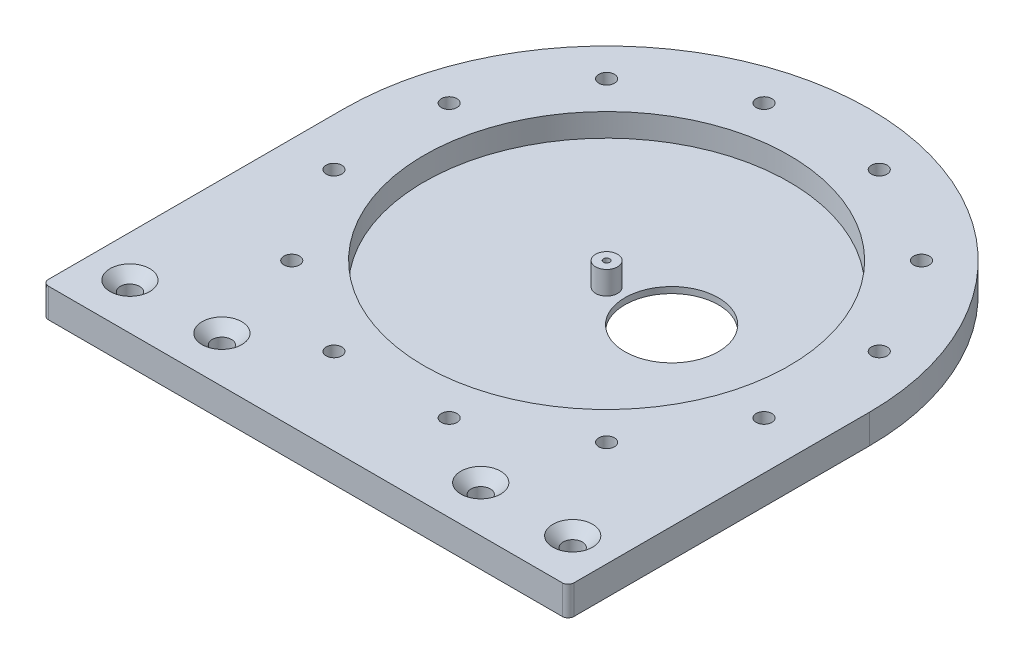
ISO-10303-21;
HEADER;
FILE_DESCRIPTION(('STEP AP214'),'2;1');
FILE_NAME('part.step','',(''),(''),'','','');
FILE_SCHEMA(('AUTOMOTIVE_DESIGN { 1 0 10303 214 1 1 1 1 }'));
ENDSEC;
DATA;
#1=APPLICATION_CONTEXT('core data for automotive mechanical design processes');
#2=APPLICATION_PROTOCOL_DEFINITION('international standard','automotive_design',2000,#1);
#3=PRODUCT_CONTEXT('',#1,'mechanical');
#4=PRODUCT('Part','Part','',(#3));
#5=PRODUCT_RELATED_PRODUCT_CATEGORY('part','',(#4));
#6=PRODUCT_DEFINITION_FORMATION('','',#4);
#7=PRODUCT_DEFINITION_CONTEXT('part definition',#1,'design');
#8=PRODUCT_DEFINITION('design','',#6,#7);
#9=PRODUCT_DEFINITION_SHAPE('','',#8);
#10=(LENGTH_UNIT() NAMED_UNIT(*) SI_UNIT(.MILLI.,.METRE.));
#11=(NAMED_UNIT(*) PLANE_ANGLE_UNIT() SI_UNIT($,.RADIAN.));
#12=(NAMED_UNIT(*) SI_UNIT($,.STERADIAN.) SOLID_ANGLE_UNIT());
#13=UNCERTAINTY_MEASURE_WITH_UNIT(LENGTH_MEASURE(1.E-05),#10,'distance_accuracy_value','');
#14=(GEOMETRIC_REPRESENTATION_CONTEXT(3) GLOBAL_UNCERTAINTY_ASSIGNED_CONTEXT((#13)) GLOBAL_UNIT_ASSIGNED_CONTEXT((#10,
#11,#12)) REPRESENTATION_CONTEXT('',''));
#15=CARTESIAN_POINT('',(0.,0.,0.));
#16=DIRECTION('',(0.,0.,1.));
#17=DIRECTION('',(1.,0.,0.));
#18=AXIS2_PLACEMENT_3D('',#15,#16,#17);
#19=CARTESIAN_POINT('',(0.,12.7,0.));
#20=DIRECTION('',(0.,1.,0.));
#21=DIRECTION('',(0.,0.,1.));
#22=AXIS2_PLACEMENT_3D('',#19,#20,#21);
#23=PLANE('',#22);
#24=CARTESIAN_POINT('',(-96.3,12.7,111.040453687));
#25=DIRECTION('',(0.,1.,0.));
#26=DIRECTION('',(0.,0.,1.));
#27=AXIS2_PLACEMENT_3D('',#24,#25,#26);
#28=CIRCLE('',#27,8.65000000000001);
#29=CARTESIAN_POINT('',(-96.3,12.7,119.690453687));
#30=VERTEX_POINT('',#29);
#31=EDGE_CURVE('E308',#30,#30,#28,.T.);
#32=ORIENTED_EDGE('',*,*,#31,.F.);
#33=EDGE_LOOP('',(#32));
#34=FACE_BOUND('',#33,.T.);
#35=CARTESIAN_POINT('',(-56.3,12.7,111.040453687));
#36=DIRECTION('',(0.,1.,0.));
#37=DIRECTION('',(0.,0.,1.));
#38=AXIS2_PLACEMENT_3D('',#35,#36,#37);
#39=CIRCLE('',#38,8.65);
#40=CARTESIAN_POINT('',(-56.3,12.7,119.690453687));
#41=VERTEX_POINT('',#40);
#42=EDGE_CURVE('E319',#41,#41,#39,.T.);
#43=ORIENTED_EDGE('',*,*,#42,.F.);
#44=EDGE_LOOP('',(#43));
#45=FACE_BOUND('',#44,.T.);
#46=CARTESIAN_POINT('',(56.3,12.7,111.040453687));
#47=DIRECTION('',(0.,1.,0.));
#48=DIRECTION('',(0.,0.,1.));
#49=AXIS2_PLACEMENT_3D('',#46,#47,#48);
#50=CIRCLE('',#49,8.65);
#51=CARTESIAN_POINT('',(56.3,12.7,119.690453687));
#52=VERTEX_POINT('',#51);
#53=EDGE_CURVE('E328',#52,#52,#50,.T.);
#54=ORIENTED_EDGE('',*,*,#53,.F.);
#55=EDGE_LOOP('',(#54));
#56=FACE_BOUND('',#55,.T.);
#57=CARTESIAN_POINT('',(96.3,12.7,111.040453687));
#58=DIRECTION('',(0.,1.,0.));
#59=DIRECTION('',(0.,0.,1.));
#60=AXIS2_PLACEMENT_3D('',#57,#58,#59);
#61=CIRCLE('',#60,8.65000000000001);
#62=CARTESIAN_POINT('',(96.3,12.7,119.690453687));
#63=VERTEX_POINT('',#62);
#64=EDGE_CURVE('E337',#63,#63,#61,.T.);
#65=ORIENTED_EDGE('',*,*,#64,.F.);
#66=EDGE_LOOP('',(#65));
#67=FACE_BOUND('',#66,.T.);
#68=CARTESIAN_POINT('',(-93.5378422032675,12.7,-25.063389280116));
#69=DIRECTION('',(0.,1.,0.));
#70=DIRECTION('',(0.,0.,1.));
#71=AXIS2_PLACEMENT_3D('',#68,#69,#70);
#72=CIRCLE('',#71,3.4);
#73=CARTESIAN_POINT('',(-93.5378422032675,12.7,-21.663389280116));
#74=VERTEX_POINT('',#73);
#75=EDGE_CURVE('E346',#74,#74,#72,.T.);
#76=ORIENTED_EDGE('',*,*,#75,.F.);
#77=EDGE_LOOP('',(#76));
#78=FACE_BOUND('',#77,.T.);
#79=CARTESIAN_POINT('',(-93.5378422032678,12.7,25.0633892801148));
#80=DIRECTION('',(0.,1.,0.));
#81=DIRECTION('',(0.,0.,1.));
#82=AXIS2_PLACEMENT_3D('',#79,#80,#81);
#83=CIRCLE('',#82,3.4);
#84=CARTESIAN_POINT('',(-93.5378422032678,12.7,28.4633892801148));
#85=VERTEX_POINT('',#84);
#86=EDGE_CURVE('E352',#85,#85,#83,.T.);
#87=ORIENTED_EDGE('',*,*,#86,.F.);
#88=EDGE_LOOP('',(#87));
#89=FACE_BOUND('',#88,.T.);
#90=CARTESIAN_POINT('',(-25.0633892801151,12.7,-93.5378422032677));
#91=DIRECTION('',(0.,1.,0.));
#92=DIRECTION('',(0.,0.,1.));
#93=AXIS2_PLACEMENT_3D('',#90,#91,#92);
#94=CIRCLE('',#93,3.4);
#95=CARTESIAN_POINT('',(-25.0633892801151,12.7,-90.1378422032677));
#96=VERTEX_POINT('',#95);
#97=EDGE_CURVE('E358',#96,#96,#94,.T.);
#98=ORIENTED_EDGE('',*,*,#97,.F.);
#99=EDGE_LOOP('',(#98));
#100=FACE_BOUND('',#99,.T.);
#101=CARTESIAN_POINT('',(-68.4744529231522,12.7,-68.4744529231524));
#102=DIRECTION('',(0.,1.,0.));
#103=DIRECTION('',(0.,0.,1.));
#104=AXIS2_PLACEMENT_3D('',#101,#102,#103);
#105=CIRCLE('',#104,3.4);
#106=CARTESIAN_POINT('',(-68.4744529231522,12.7,-65.0744529231524));
#107=VERTEX_POINT('',#106);
#108=EDGE_CURVE('E364',#107,#107,#105,.T.);
#109=ORIENTED_EDGE('',*,*,#108,.F.);
#110=EDGE_LOOP('',(#109));
#111=FACE_BOUND('',#110,.T.);
#112=CARTESIAN_POINT('',(25.0633892801151,12.7,-93.5378422032677));
#113=DIRECTION('',(0.,1.,0.));
#114=DIRECTION('',(0.,0.,1.));
#115=AXIS2_PLACEMENT_3D('',#112,#113,#114);
#116=CIRCLE('',#115,3.4);
#117=CARTESIAN_POINT('',(25.0633892801151,12.7,-90.1378422032677));
#118=VERTEX_POINT('',#117);
#119=EDGE_CURVE('E370',#118,#118,#116,.T.);
#120=ORIENTED_EDGE('',*,*,#119,.F.);
#121=EDGE_LOOP('',(#120));
#122=FACE_BOUND('',#121,.T.);
#123=CARTESIAN_POINT('',(68.4744529231516,12.7,-68.474452923153));
#124=DIRECTION('',(0.,1.,0.));
#125=DIRECTION('',(0.,0.,1.));
#126=AXIS2_PLACEMENT_3D('',#123,#124,#125);
#127=CIRCLE('',#126,3.4);
#128=CARTESIAN_POINT('',(68.4744529231516,12.7,-65.074452923153));
#129=VERTEX_POINT('',#128);
#130=EDGE_CURVE('E376',#129,#129,#127,.T.);
#131=ORIENTED_EDGE('',*,*,#130,.F.);
#132=EDGE_LOOP('',(#131));
#133=FACE_BOUND('',#132,.T.);
#134=CARTESIAN_POINT('',(93.5378422032673,12.7,-25.0633892801167));
#135=DIRECTION('',(0.,1.,0.));
#136=DIRECTION('',(0.,0.,1.));
#137=AXIS2_PLACEMENT_3D('',#134,#135,#136);
#138=CIRCLE('',#137,3.4);
#139=CARTESIAN_POINT('',(93.5378422032673,12.7,-21.6633892801167));
#140=VERTEX_POINT('',#139);
#141=EDGE_CURVE('E382',#140,#140,#138,.T.);
#142=ORIENTED_EDGE('',*,*,#141,.F.);
#143=EDGE_LOOP('',(#142));
#144=FACE_BOUND('',#143,.T.);
#145=CARTESIAN_POINT('',(93.5378422032673,12.7,25.0633892801167));
#146=DIRECTION('',(0.,1.,0.));
#147=DIRECTION('',(0.,0.,1.));
#148=AXIS2_PLACEMENT_3D('',#145,#146,#147);
#149=CIRCLE('',#148,3.4);
#150=CARTESIAN_POINT('',(93.5378422032673,12.7,28.4633892801167));
#151=VERTEX_POINT('',#150);
#152=EDGE_CURVE('E388',#151,#151,#149,.T.);
#153=ORIENTED_EDGE('',*,*,#152,.F.);
#154=EDGE_LOOP('',(#153));
#155=FACE_BOUND('',#154,.T.);
#156=CARTESIAN_POINT('',(68.4744529231519,12.7,68.4744529231527));
#157=DIRECTION('',(0.,1.,0.));
#158=DIRECTION('',(0.,0.,1.));
#159=AXIS2_PLACEMENT_3D('',#156,#157,#158);
#160=CIRCLE('',#159,3.4);
#161=CARTESIAN_POINT('',(68.4744529231519,12.7,71.8744529231527));
#162=VERTEX_POINT('',#161);
#163=EDGE_CURVE('E394',#162,#162,#160,.T.);
#164=ORIENTED_EDGE('',*,*,#163,.F.);
#165=EDGE_LOOP('',(#164));
#166=FACE_BOUND('',#165,.T.);
#167=CARTESIAN_POINT('',(25.0633892801151,12.7,93.5378422032677));
#168=DIRECTION('',(0.,1.,0.));
#169=DIRECTION('',(0.,0.,1.));
#170=AXIS2_PLACEMENT_3D('',#167,#168,#169);
#171=CIRCLE('',#170,3.4);
#172=CARTESIAN_POINT('',(25.0633892801151,12.7,96.9378422032677));
#173=VERTEX_POINT('',#172);
#174=EDGE_CURVE('E400',#173,#173,#171,.T.);
#175=ORIENTED_EDGE('',*,*,#174,.F.);
#176=EDGE_LOOP('',(#175));
#177=FACE_BOUND('',#176,.T.);
#178=CARTESIAN_POINT('',(-25.0633892801158,12.7,93.5378422032675));
#179=DIRECTION('',(0.,1.,0.));
#180=DIRECTION('',(0.,0.,1.));
#181=AXIS2_PLACEMENT_3D('',#178,#179,#180);
#182=CIRCLE('',#181,3.4);
#183=CARTESIAN_POINT('',(-25.0633892801158,12.7,96.9378422032675));
#184=VERTEX_POINT('',#183);
#185=EDGE_CURVE('E406',#184,#184,#182,.T.);
#186=ORIENTED_EDGE('',*,*,#185,.F.);
#187=EDGE_LOOP('',(#186));
#188=FACE_BOUND('',#187,.T.);
#189=CARTESIAN_POINT('',(-68.4744529231526,12.7,68.474452923152));
#190=DIRECTION('',(0.,1.,0.));
#191=DIRECTION('',(0.,0.,1.));
#192=AXIS2_PLACEMENT_3D('',#189,#190,#191);
#193=CIRCLE('',#192,3.4);
#194=CARTESIAN_POINT('',(-68.4744529231526,12.7,71.874452923152));
#195=VERTEX_POINT('',#194);
#196=EDGE_CURVE('E198',#195,#195,#193,.T.);
#197=ORIENTED_EDGE('',*,*,#196,.F.);
#198=EDGE_LOOP('',(#197));
#199=FACE_BOUND('',#198,.T.);
#200=CARTESIAN_POINT('',(0.,12.7,0.));
#201=DIRECTION('',(0.,1.,0.));
#202=DIRECTION('',(0.,0.,1.));
#203=AXIS2_PLACEMENT_3D('',#200,#201,#202);
#204=CIRCLE('',#203,79.375);
#205=CARTESIAN_POINT('',(0.,12.7,79.375));
#206=VERTEX_POINT('',#205);
#207=EDGE_CURVE('E195',#206,#206,#204,.T.);
#208=ORIENTED_EDGE('',*,*,#207,.F.);
#209=EDGE_LOOP('',(#208));
#210=FACE_BOUND('',#209,.T.);
#211=DIRECTION('',(0.,0.,1.));
#212=VECTOR('',#211,1.);
#213=CARTESIAN_POINT('',(-114.3,12.7,0.));
#214=LINE('',#213,#212);
#215=CARTESIAN_POINT('',(-114.3,12.7,0.));
#216=VERTEX_POINT('',#215);
#217=CARTESIAN_POINT('',(-114.3,12.7,128.500453687));
#218=VERTEX_POINT('',#217);
#219=EDGE_CURVE('E88',#216,#218,#214,.T.);
#220=ORIENTED_EDGE('',*,*,#219,.T.);
#221=CARTESIAN_POINT('',(-111.76,12.7,128.500453687));
#222=DIRECTION('',(0.,1.,0.));
#223=DIRECTION('',(0.,0.,1.));
#224=AXIS2_PLACEMENT_3D('',#221,#222,#223);
#225=CIRCLE('',#224,2.54);
#226=CARTESIAN_POINT('',(-111.76,12.7,131.040453687));
#227=VERTEX_POINT('',#226);
#228=EDGE_CURVE('E43',#218,#227,#225,.T.);
#229=ORIENTED_EDGE('',*,*,#228,.T.);
#230=DIRECTION('',(1.,0.,0.));
#231=VECTOR('',#230,1.);
#232=CARTESIAN_POINT('',(-114.3,12.7,131.040453687));
#233=LINE('',#232,#231);
#234=CARTESIAN_POINT('',(111.76,12.7,131.040453687));
#235=VERTEX_POINT('',#234);
#236=EDGE_CURVE('E95',#227,#235,#233,.T.);
#237=ORIENTED_EDGE('',*,*,#236,.T.);
#238=CARTESIAN_POINT('',(111.76,12.7,128.500453687));
#239=DIRECTION('',(0.,1.,0.));
#240=DIRECTION('',(0.,0.,1.));
#241=AXIS2_PLACEMENT_3D('',#238,#239,#240);
#242=CIRCLE('',#241,2.54);
#243=CARTESIAN_POINT('',(114.3,12.7,128.500453687));
#244=VERTEX_POINT('',#243);
#245=EDGE_CURVE('E50',#235,#244,#242,.T.);
#246=ORIENTED_EDGE('',*,*,#245,.T.);
#247=DIRECTION('',(0.,0.,-1.));
#248=VECTOR('',#247,1.);
#249=CARTESIAN_POINT('',(114.3,12.7,131.040453687));
#250=LINE('',#249,#248);
#251=CARTESIAN_POINT('',(114.3,12.7,0.));
#252=VERTEX_POINT('',#251);
#253=EDGE_CURVE('E99',#244,#252,#250,.T.);
#254=ORIENTED_EDGE('',*,*,#253,.T.);
#255=CARTESIAN_POINT('',(0.,12.7,0.));
#256=DIRECTION('',(0.,1.,0.));
#257=DIRECTION('',(0.,0.,1.));
#258=AXIS2_PLACEMENT_3D('',#255,#256,#257);
#259=CIRCLE('',#258,114.3);
#260=EDGE_CURVE('E96',#252,#216,#259,.T.);
#261=ORIENTED_EDGE('',*,*,#260,.T.);
#262=EDGE_LOOP('',(#220,#229,#237,#246,#254,#261));
#263=FACE_BOUND('',#262,.T.);
#264=ADVANCED_FACE('F35',(#34,#45,#56,#67,#78,#89,#100,#111,#122,#133,#144,#155,#166,#177,#188,
#199,#210,#263),#23,.T.);
#265=CARTESIAN_POINT('',(0.,0.,0.));
#266=DIRECTION('',(0.,1.,0.));
#267=DIRECTION('',(0.,0.,1.));
#268=AXIS2_PLACEMENT_3D('',#265,#266,#267);
#269=PLANE('',#268);
#270=CARTESIAN_POINT('',(0.,0.,0.));
#271=DIRECTION('',(0.,1.,0.));
#272=DIRECTION('',(0.,0.,1.));
#273=AXIS2_PLACEMENT_3D('',#270,#271,#272);
#274=CIRCLE('',#273,1.35254999999997);
#275=CARTESIAN_POINT('',(0.,0.,1.35254999999997));
#276=VERTEX_POINT('',#275);
#277=EDGE_CURVE('E300',#276,#276,#274,.T.);
#278=ORIENTED_EDGE('',*,*,#277,.T.);
#279=EDGE_LOOP('',(#278));
#280=FACE_BOUND('',#279,.T.);
#281=CARTESIAN_POINT('',(28.284271346,0.,0.));
#282=DIRECTION('',(0.,1.,0.));
#283=DIRECTION('',(0.,0.,1.));
#284=AXIS2_PLACEMENT_3D('',#281,#282,#283);
#285=CIRCLE('',#284,20.346771346);
#286=CARTESIAN_POINT('',(28.284271346,0.,20.346771346));
#287=VERTEX_POINT('',#286);
#288=EDGE_CURVE('E305',#287,#287,#285,.T.);
#289=ORIENTED_EDGE('',*,*,#288,.T.);
#290=EDGE_LOOP('',(#289));
#291=FACE_BOUND('',#290,.T.);
#292=CARTESIAN_POINT('',(-96.3,0.,111.040453687));
#293=DIRECTION('',(0.,1.,0.));
#294=DIRECTION('',(0.,0.,1.));
#295=AXIS2_PLACEMENT_3D('',#292,#293,#294);
#296=CIRCLE('',#295,4.19999999999997);
#297=CARTESIAN_POINT('',(-96.3,0.,115.240453687));
#298=VERTEX_POINT('',#297);
#299=EDGE_CURVE('E316',#298,#298,#296,.T.);
#300=ORIENTED_EDGE('',*,*,#299,.T.);
#301=EDGE_LOOP('',(#300));
#302=FACE_BOUND('',#301,.T.);
#303=CARTESIAN_POINT('',(-56.3,0.,111.040453687));
#304=DIRECTION('',(0.,1.,0.));
#305=DIRECTION('',(0.,0.,1.));
#306=AXIS2_PLACEMENT_3D('',#303,#304,#305);
#307=CIRCLE('',#306,4.19999999999997);
#308=CARTESIAN_POINT('',(-56.3,0.,115.240453687));
#309=VERTEX_POINT('',#308);
#310=EDGE_CURVE('E325',#309,#309,#307,.T.);
#311=ORIENTED_EDGE('',*,*,#310,.T.);
#312=EDGE_LOOP('',(#311));
#313=FACE_BOUND('',#312,.T.);
#314=CARTESIAN_POINT('',(56.3,0.,111.040453687));
#315=DIRECTION('',(0.,1.,0.));
#316=DIRECTION('',(0.,0.,1.));
#317=AXIS2_PLACEMENT_3D('',#314,#315,#316);
#318=CIRCLE('',#317,4.19999999999997);
#319=CARTESIAN_POINT('',(56.3,0.,115.240453687));
#320=VERTEX_POINT('',#319);
#321=EDGE_CURVE('E334',#320,#320,#318,.T.);
#322=ORIENTED_EDGE('',*,*,#321,.T.);
#323=EDGE_LOOP('',(#322));
#324=FACE_BOUND('',#323,.T.);
#325=CARTESIAN_POINT('',(96.3,0.,111.040453687));
#326=DIRECTION('',(0.,1.,0.));
#327=DIRECTION('',(0.,0.,1.));
#328=AXIS2_PLACEMENT_3D('',#325,#326,#327);
#329=CIRCLE('',#328,4.19999999999997);
#330=CARTESIAN_POINT('',(96.3,0.,115.240453687));
#331=VERTEX_POINT('',#330);
#332=EDGE_CURVE('E343',#331,#331,#329,.T.);
#333=ORIENTED_EDGE('',*,*,#332,.T.);
#334=EDGE_LOOP('',(#333));
#335=FACE_BOUND('',#334,.T.);
#336=CARTESIAN_POINT('',(-93.5378422032675,0.,-25.063389280116));
#337=DIRECTION('',(0.,1.,0.));
#338=DIRECTION('',(0.,0.,1.));
#339=AXIS2_PLACEMENT_3D('',#336,#337,#338);
#340=CIRCLE('',#339,3.39999999999997);
#341=CARTESIAN_POINT('',(-93.5378422032675,0.,-21.663389280116));
#342=VERTEX_POINT('',#341);
#343=EDGE_CURVE('E349',#342,#342,#340,.T.);
#344=ORIENTED_EDGE('',*,*,#343,.T.);
#345=EDGE_LOOP('',(#344));
#346=FACE_BOUND('',#345,.T.);
#347=CARTESIAN_POINT('',(-93.5378422032678,0.,25.0633892801148));
#348=DIRECTION('',(0.,1.,0.));
#349=DIRECTION('',(0.,0.,1.));
#350=AXIS2_PLACEMENT_3D('',#347,#348,#349);
#351=CIRCLE('',#350,3.39999999999997);
#352=CARTESIAN_POINT('',(-93.5378422032678,0.,28.4633892801148));
#353=VERTEX_POINT('',#352);
#354=EDGE_CURVE('E355',#353,#353,#351,.T.);
#355=ORIENTED_EDGE('',*,*,#354,.T.);
#356=EDGE_LOOP('',(#355));
#357=FACE_BOUND('',#356,.T.);
#358=CARTESIAN_POINT('',(-25.0633892801151,0.,-93.5378422032677));
#359=DIRECTION('',(0.,1.,0.));
#360=DIRECTION('',(0.,0.,1.));
#361=AXIS2_PLACEMENT_3D('',#358,#359,#360);
#362=CIRCLE('',#361,3.39999999999997);
#363=CARTESIAN_POINT('',(-25.0633892801151,0.,-90.1378422032677));
#364=VERTEX_POINT('',#363);
#365=EDGE_CURVE('E361',#364,#364,#362,.T.);
#366=ORIENTED_EDGE('',*,*,#365,.T.);
#367=EDGE_LOOP('',(#366));
#368=FACE_BOUND('',#367,.T.);
#369=CARTESIAN_POINT('',(-68.4744529231522,0.,-68.4744529231524));
#370=DIRECTION('',(0.,1.,0.));
#371=DIRECTION('',(0.,0.,1.));
#372=AXIS2_PLACEMENT_3D('',#369,#370,#371);
#373=CIRCLE('',#372,3.39999999999997);
#374=CARTESIAN_POINT('',(-68.4744529231522,0.,-65.0744529231524));
#375=VERTEX_POINT('',#374);
#376=EDGE_CURVE('E367',#375,#375,#373,.T.);
#377=ORIENTED_EDGE('',*,*,#376,.T.);
#378=EDGE_LOOP('',(#377));
#379=FACE_BOUND('',#378,.T.);
#380=CARTESIAN_POINT('',(25.0633892801151,0.,-93.5378422032677));
#381=DIRECTION('',(0.,1.,0.));
#382=DIRECTION('',(0.,0.,1.));
#383=AXIS2_PLACEMENT_3D('',#380,#381,#382);
#384=CIRCLE('',#383,3.39999999999997);
#385=CARTESIAN_POINT('',(25.0633892801151,0.,-90.1378422032677));
#386=VERTEX_POINT('',#385);
#387=EDGE_CURVE('E373',#386,#386,#384,.T.);
#388=ORIENTED_EDGE('',*,*,#387,.T.);
#389=EDGE_LOOP('',(#388));
#390=FACE_BOUND('',#389,.T.);
#391=CARTESIAN_POINT('',(68.4744529231516,0.,-68.474452923153));
#392=DIRECTION('',(0.,1.,0.));
#393=DIRECTION('',(0.,0.,1.));
#394=AXIS2_PLACEMENT_3D('',#391,#392,#393);
#395=CIRCLE('',#394,3.39999999999997);
#396=CARTESIAN_POINT('',(68.4744529231516,0.,-65.074452923153));
#397=VERTEX_POINT('',#396);
#398=EDGE_CURVE('E379',#397,#397,#395,.T.);
#399=ORIENTED_EDGE('',*,*,#398,.T.);
#400=EDGE_LOOP('',(#399));
#401=FACE_BOUND('',#400,.T.);
#402=CARTESIAN_POINT('',(93.5378422032673,0.,-25.0633892801167));
#403=DIRECTION('',(0.,1.,0.));
#404=DIRECTION('',(0.,0.,1.));
#405=AXIS2_PLACEMENT_3D('',#402,#403,#404);
#406=CIRCLE('',#405,3.39999999999997);
#407=CARTESIAN_POINT('',(93.5378422032673,0.,-21.6633892801167));
#408=VERTEX_POINT('',#407);
#409=EDGE_CURVE('E385',#408,#408,#406,.T.);
#410=ORIENTED_EDGE('',*,*,#409,.T.);
#411=EDGE_LOOP('',(#410));
#412=FACE_BOUND('',#411,.T.);
#413=CARTESIAN_POINT('',(93.5378422032673,0.,25.0633892801167));
#414=DIRECTION('',(0.,1.,0.));
#415=DIRECTION('',(0.,0.,1.));
#416=AXIS2_PLACEMENT_3D('',#413,#414,#415);
#417=CIRCLE('',#416,3.39999999999997);
#418=CARTESIAN_POINT('',(93.5378422032673,0.,28.4633892801167));
#419=VERTEX_POINT('',#418);
#420=EDGE_CURVE('E391',#419,#419,#417,.T.);
#421=ORIENTED_EDGE('',*,*,#420,.T.);
#422=EDGE_LOOP('',(#421));
#423=FACE_BOUND('',#422,.T.);
#424=CARTESIAN_POINT('',(68.4744529231519,0.,68.4744529231527));
#425=DIRECTION('',(0.,1.,0.));
#426=DIRECTION('',(0.,0.,1.));
#427=AXIS2_PLACEMENT_3D('',#424,#425,#426);
#428=CIRCLE('',#427,3.39999999999997);
#429=CARTESIAN_POINT('',(68.4744529231519,0.,71.8744529231527));
#430=VERTEX_POINT('',#429);
#431=EDGE_CURVE('E397',#430,#430,#428,.T.);
#432=ORIENTED_EDGE('',*,*,#431,.T.);
#433=EDGE_LOOP('',(#432));
#434=FACE_BOUND('',#433,.T.);
#435=CARTESIAN_POINT('',(25.0633892801151,0.,93.5378422032677));
#436=DIRECTION('',(0.,1.,0.));
#437=DIRECTION('',(0.,0.,1.));
#438=AXIS2_PLACEMENT_3D('',#435,#436,#437);
#439=CIRCLE('',#438,3.39999999999997);
#440=CARTESIAN_POINT('',(25.0633892801151,0.,96.9378422032677));
#441=VERTEX_POINT('',#440);
#442=EDGE_CURVE('E403',#441,#441,#439,.T.);
#443=ORIENTED_EDGE('',*,*,#442,.T.);
#444=EDGE_LOOP('',(#443));
#445=FACE_BOUND('',#444,.T.);
#446=CARTESIAN_POINT('',(-25.0633892801158,0.,93.5378422032675));
#447=DIRECTION('',(0.,1.,0.));
#448=DIRECTION('',(0.,0.,1.));
#449=AXIS2_PLACEMENT_3D('',#446,#447,#448);
#450=CIRCLE('',#449,3.39999999999997);
#451=CARTESIAN_POINT('',(-25.0633892801158,0.,96.9378422032675));
#452=VERTEX_POINT('',#451);
#453=EDGE_CURVE('E409',#452,#452,#450,.T.);
#454=ORIENTED_EDGE('',*,*,#453,.T.);
#455=EDGE_LOOP('',(#454));
#456=FACE_BOUND('',#455,.T.);
#457=CARTESIAN_POINT('',(-68.4744529231526,0.,68.474452923152));
#458=DIRECTION('',(0.,1.,0.));
#459=DIRECTION('',(0.,0.,1.));
#460=AXIS2_PLACEMENT_3D('',#457,#458,#459);
#461=CIRCLE('',#460,3.39999999999997);
#462=CARTESIAN_POINT('',(-68.4744529231526,0.,71.874452923152));
#463=VERTEX_POINT('',#462);
#464=EDGE_CURVE('E192',#463,#463,#461,.T.);
#465=ORIENTED_EDGE('',*,*,#464,.T.);
#466=EDGE_LOOP('',(#465));
#467=FACE_BOUND('',#466,.T.);
#468=DIRECTION('',(1.,0.,0.));
#469=VECTOR('',#468,1.);
#470=CARTESIAN_POINT('',(-114.3,0.,131.040453687));
#471=LINE('',#470,#469);
#472=CARTESIAN_POINT('',(-111.76,0.,131.040453687));
#473=VERTEX_POINT('',#472);
#474=CARTESIAN_POINT('',(111.76,0.,131.040453687));
#475=VERTEX_POINT('',#474);
#476=EDGE_CURVE('E136',#473,#475,#471,.T.);
#477=ORIENTED_EDGE('',*,*,#476,.F.);
#478=CARTESIAN_POINT('',(-111.76,0.,128.500453687));
#479=DIRECTION('',(0.,1.,0.));
#480=DIRECTION('',(0.,0.,1.));
#481=AXIS2_PLACEMENT_3D('',#478,#479,#480);
#482=CIRCLE('',#481,2.54);
#483=CARTESIAN_POINT('',(-114.3,0.,128.500453687));
#484=VERTEX_POINT('',#483);
#485=EDGE_CURVE('E120',#473,#484,#482,.F.);
#486=ORIENTED_EDGE('',*,*,#485,.T.);
#487=DIRECTION('',(0.,0.,1.));
#488=VECTOR('',#487,1.);
#489=CARTESIAN_POINT('',(-114.3,0.,0.));
#490=LINE('',#489,#488);
#491=CARTESIAN_POINT('',(-114.3,0.,0.));
#492=VERTEX_POINT('',#491);
#493=EDGE_CURVE('E135',#492,#484,#490,.T.);
#494=ORIENTED_EDGE('',*,*,#493,.F.);
#495=CARTESIAN_POINT('',(0.,0.,0.));
#496=DIRECTION('',(0.,1.,0.));
#497=DIRECTION('',(0.,0.,1.));
#498=AXIS2_PLACEMENT_3D('',#495,#496,#497);
#499=CIRCLE('',#498,114.3);
#500=CARTESIAN_POINT('',(114.3,0.,0.));
#501=VERTEX_POINT('',#500);
#502=EDGE_CURVE('E107',#501,#492,#499,.T.);
#503=ORIENTED_EDGE('',*,*,#502,.F.);
#504=DIRECTION('',(0.,0.,-1.));
#505=VECTOR('',#504,1.);
#506=CARTESIAN_POINT('',(114.3,0.,131.040453687));
#507=LINE('',#506,#505);
#508=CARTESIAN_POINT('',(114.3,0.,128.500453687));
#509=VERTEX_POINT('',#508);
#510=EDGE_CURVE('E103',#509,#501,#507,.T.);
#511=ORIENTED_EDGE('',*,*,#510,.F.);
#512=CARTESIAN_POINT('',(111.76,0.,128.500453687));
#513=DIRECTION('',(0.,1.,0.));
#514=DIRECTION('',(0.,0.,1.));
#515=AXIS2_PLACEMENT_3D('',#512,#513,#514);
#516=CIRCLE('',#515,2.54);
#517=EDGE_CURVE('E118',#509,#475,#516,.F.);
#518=ORIENTED_EDGE('',*,*,#517,.T.);
#519=EDGE_LOOP('',(#477,#486,#494,#503,#511,#518));
#520=FACE_BOUND('',#519,.T.);
#521=ADVANCED_FACE('F134',(#280,#291,#302,#313,#324,#335,#346,#357,#368,#379,#390,#401,#412,
#423,#434,#445,#456,#467,#520),#269,.F.);
#522=CARTESIAN_POINT('',(0.,12.7,0.));
#523=DIRECTION('',(0.,-1.,0.));
#524=DIRECTION('',(0.,0.,-1.));
#525=AXIS2_PLACEMENT_3D('',#522,#523,#524);
#526=CYLINDRICAL_SURFACE('',#525,114.3);
#527=ORIENTED_EDGE('',*,*,#502,.T.);
#528=DIRECTION('',(0.,-1.,0.));
#529=VECTOR('',#528,1.);
#530=CARTESIAN_POINT('',(-114.3,12.7,0.));
#531=LINE('',#530,#529);
#532=EDGE_CURVE('E92',#216,#492,#531,.T.);
#533=ORIENTED_EDGE('',*,*,#532,.F.);
#534=ORIENTED_EDGE('',*,*,#260,.F.);
#535=DIRECTION('',(0.,-1.,0.));
#536=VECTOR('',#535,1.);
#537=CARTESIAN_POINT('',(114.3,12.7,0.));
#538=LINE('',#537,#536);
#539=EDGE_CURVE('E109',#252,#501,#538,.T.);
#540=ORIENTED_EDGE('',*,*,#539,.T.);
#541=EDGE_LOOP('',(#527,#533,#534,#540));
#542=FACE_BOUND('',#541,.T.);
#543=ADVANCED_FACE('F105',(#542),#526,.T.);
#544=CARTESIAN_POINT('',(-114.3,12.7,0.));
#545=DIRECTION('',(1.,0.,0.));
#546=DIRECTION('',(0.,0.,-1.));
#547=AXIS2_PLACEMENT_3D('',#544,#545,#546);
#548=PLANE('',#547);
#549=ORIENTED_EDGE('',*,*,#493,.T.);
#550=DIRECTION('',(0.,-1.,0.));
#551=VECTOR('',#550,1.);
#552=CARTESIAN_POINT('',(-114.3,12.7,128.500453687));
#553=LINE('',#552,#551);
#554=EDGE_CURVE('E58',#484,#218,#553,.F.);
#555=ORIENTED_EDGE('',*,*,#554,.T.);
#556=ORIENTED_EDGE('',*,*,#219,.F.);
#557=ORIENTED_EDGE('',*,*,#532,.T.);
#558=EDGE_LOOP('',(#549,#555,#556,#557));
#559=FACE_BOUND('',#558,.T.);
#560=ADVANCED_FACE('F90',(#559),#548,.F.);
#561=CARTESIAN_POINT('',(-114.3,12.7,131.040453687));
#562=DIRECTION('',(0.,0.,-1.));
#563=DIRECTION('',(-1.,0.,0.));
#564=AXIS2_PLACEMENT_3D('',#561,#562,#563);
#565=PLANE('',#564);
#566=ORIENTED_EDGE('',*,*,#236,.F.);
#567=DIRECTION('',(0.,-1.,0.));
#568=VECTOR('',#567,1.);
#569=CARTESIAN_POINT('',(-111.76,12.7,131.040453687));
#570=LINE('',#569,#568);
#571=EDGE_CURVE('E111',#227,#473,#570,.T.);
#572=ORIENTED_EDGE('',*,*,#571,.T.);
#573=ORIENTED_EDGE('',*,*,#476,.T.);
#574=DIRECTION('',(0.,-1.,0.));
#575=VECTOR('',#574,1.);
#576=CARTESIAN_POINT('',(111.76,12.7,131.040453687));
#577=LINE('',#576,#575);
#578=EDGE_CURVE('E108',#475,#235,#577,.F.);
#579=ORIENTED_EDGE('',*,*,#578,.T.);
#580=EDGE_LOOP('',(#566,#572,#573,#579));
#581=FACE_BOUND('',#580,.T.);
#582=ADVANCED_FACE('F127',(#581),#565,.F.);
#583=CARTESIAN_POINT('',(114.3,12.7,131.040453687));
#584=DIRECTION('',(-1.,0.,0.));
#585=DIRECTION('',(0.,0.,1.));
#586=AXIS2_PLACEMENT_3D('',#583,#584,#585);
#587=PLANE('',#586);
#588=ORIENTED_EDGE('',*,*,#253,.F.);
#589=DIRECTION('',(0.,-1.,0.));
#590=VECTOR('',#589,1.);
#591=CARTESIAN_POINT('',(114.3,12.7,128.500453687));
#592=LINE('',#591,#590);
#593=EDGE_CURVE('E11',#244,#509,#592,.T.);
#594=ORIENTED_EDGE('',*,*,#593,.T.);
#595=ORIENTED_EDGE('',*,*,#510,.T.);
#596=ORIENTED_EDGE('',*,*,#539,.F.);
#597=EDGE_LOOP('',(#588,#594,#595,#596));
#598=FACE_BOUND('',#597,.T.);
#599=ADVANCED_FACE('F144',(#598),#587,.F.);
#600=CARTESIAN_POINT('',(0.,2.667,0.));
#601=DIRECTION('',(0.,1.,0.));
#602=DIRECTION('',(0.,0.,1.));
#603=AXIS2_PLACEMENT_3D('',#600,#601,#602);
#604=CYLINDRICAL_SURFACE('',#603,79.375);
#605=CARTESIAN_POINT('',(0.,2.667,0.));
#606=DIRECTION('',(0.,1.,0.));
#607=DIRECTION('',(0.,0.,1.));
#608=AXIS2_PLACEMENT_3D('',#605,#606,#607);
#609=CIRCLE('',#608,79.375);
#610=CARTESIAN_POINT('',(0.,2.667,79.375));
#611=VERTEX_POINT('',#610);
#612=EDGE_CURVE('E139',#611,#611,#609,.T.);
#613=ORIENTED_EDGE('',*,*,#612,.F.);
#614=EDGE_LOOP('',(#613));
#615=FACE_BOUND('',#614,.T.);
#616=ORIENTED_EDGE('',*,*,#207,.T.);
#617=EDGE_LOOP('',(#616));
#618=FACE_BOUND('',#617,.T.);
#619=ADVANCED_FACE('F206',(#615,#618),#604,.F.);
#620=CARTESIAN_POINT('',(0.,2.667,0.));
#621=DIRECTION('',(0.,1.,0.));
#622=DIRECTION('',(0.,0.,1.));
#623=AXIS2_PLACEMENT_3D('',#620,#621,#622);
#624=PLANE('',#623);
#625=CARTESIAN_POINT('',(28.284271346,2.667,0.));
#626=DIRECTION('',(0.,1.,0.));
#627=DIRECTION('',(0.,0.,1.));
#628=AXIS2_PLACEMENT_3D('',#625,#626,#627);
#629=CIRCLE('',#628,20.346771346);
#630=CARTESIAN_POINT('',(28.284271346,2.667,20.346771346));
#631=VERTEX_POINT('',#630);
#632=EDGE_CURVE('E302',#631,#631,#629,.T.);
#633=ORIENTED_EDGE('',*,*,#632,.F.);
#634=EDGE_LOOP('',(#633));
#635=FACE_BOUND('',#634,.T.);
#636=CARTESIAN_POINT('',(0.,2.667,0.));
#637=DIRECTION('',(0.,1.,0.));
#638=DIRECTION('',(0.,0.,1.));
#639=AXIS2_PLACEMENT_3D('',#636,#637,#638);
#640=CIRCLE('',#639,4.7625);
#641=CARTESIAN_POINT('',(0.,2.667,4.7625));
#642=VERTEX_POINT('',#641);
#643=EDGE_CURVE('E191',#642,#642,#640,.T.);
#644=ORIENTED_EDGE('',*,*,#643,.F.);
#645=EDGE_LOOP('',(#644));
#646=FACE_BOUND('',#645,.T.);
#647=ORIENTED_EDGE('',*,*,#612,.T.);
#648=EDGE_LOOP('',(#647));
#649=FACE_BOUND('',#648,.T.);
#650=ADVANCED_FACE('F180',(#635,#646,#649),#624,.T.);
#651=CARTESIAN_POINT('',(0.,2.667,0.));
#652=DIRECTION('',(0.,1.,0.));
#653=DIRECTION('',(0.,0.,1.));
#654=AXIS2_PLACEMENT_3D('',#651,#652,#653);
#655=CYLINDRICAL_SURFACE('',#654,4.7625);
#656=ORIENTED_EDGE('',*,*,#643,.T.);
#657=EDGE_LOOP('',(#656));
#658=FACE_BOUND('',#657,.T.);
#659=CARTESIAN_POINT('',(0.,12.7,0.));
#660=DIRECTION('',(0.,1.,0.));
#661=DIRECTION('',(0.,0.,1.));
#662=AXIS2_PLACEMENT_3D('',#659,#660,#661);
#663=CIRCLE('',#662,4.7625);
#664=CARTESIAN_POINT('',(0.,12.7,4.7625));
#665=VERTEX_POINT('',#664);
#666=EDGE_CURVE('E189',#665,#665,#663,.T.);
#667=ORIENTED_EDGE('',*,*,#666,.F.);
#668=EDGE_LOOP('',(#667));
#669=FACE_BOUND('',#668,.T.);
#670=ADVANCED_FACE('F171',(#658,#669),#655,.T.);
#671=CARTESIAN_POINT('',(0.,12.7,0.));
#672=DIRECTION('',(0.,1.,0.));
#673=DIRECTION('',(0.,0.,1.));
#674=AXIS2_PLACEMENT_3D('',#671,#672,#673);
#675=CIRCLE('',#674,1.35254999999999);
#676=CARTESIAN_POINT('',(0.,12.7,1.35254999999999));
#677=VERTEX_POINT('',#676);
#678=EDGE_CURVE('E186',#677,#677,#675,.T.);
#679=ORIENTED_EDGE('',*,*,#678,.F.);
#680=EDGE_LOOP('',(#679));
#681=FACE_BOUND('',#680,.T.);
#682=ORIENTED_EDGE('',*,*,#666,.T.);
#683=EDGE_LOOP('',(#682));
#684=FACE_BOUND('',#683,.T.);
#685=ADVANCED_FACE('F160',(#681,#684),#23,.T.);
#686=CARTESIAN_POINT('',(-68.4744529231526,12.7,68.474452923152));
#687=DIRECTION('',(0.,1.,0.));
#688=DIRECTION('',(0.,0.,1.));
#689=AXIS2_PLACEMENT_3D('',#686,#687,#688);
#690=CYLINDRICAL_SURFACE('',#689,3.39999999999999);
#691=ORIENTED_EDGE('',*,*,#464,.F.);
#692=EDGE_LOOP('',(#691));
#693=FACE_BOUND('',#692,.T.);
#694=ORIENTED_EDGE('',*,*,#196,.T.);
#695=EDGE_LOOP('',(#694));
#696=FACE_BOUND('',#695,.T.);
#697=ADVANCED_FACE('F170',(#693,#696),#690,.F.);
#698=CARTESIAN_POINT('',(-25.0633892801158,12.7,93.5378422032675));
#699=DIRECTION('',(0.,1.,0.));
#700=DIRECTION('',(0.,0.,1.));
#701=AXIS2_PLACEMENT_3D('',#698,#699,#700);
#702=CYLINDRICAL_SURFACE('',#701,3.39999999999998);
#703=ORIENTED_EDGE('',*,*,#453,.F.);
#704=EDGE_LOOP('',(#703));
#705=FACE_BOUND('',#704,.T.);
#706=ORIENTED_EDGE('',*,*,#185,.T.);
#707=EDGE_LOOP('',(#706));
#708=FACE_BOUND('',#707,.T.);
#709=ADVANCED_FACE('F177',(#705,#708),#702,.F.);
#710=CARTESIAN_POINT('',(25.0633892801151,12.7,93.5378422032677));
#711=DIRECTION('',(0.,1.,0.));
#712=DIRECTION('',(0.,0.,1.));
#713=AXIS2_PLACEMENT_3D('',#710,#711,#712);
#714=CYLINDRICAL_SURFACE('',#713,3.39999999999998);
#715=ORIENTED_EDGE('',*,*,#442,.F.);
#716=EDGE_LOOP('',(#715));
#717=FACE_BOUND('',#716,.T.);
#718=ORIENTED_EDGE('',*,*,#174,.T.);
#719=EDGE_LOOP('',(#718));
#720=FACE_BOUND('',#719,.T.);
#721=ADVANCED_FACE('F221',(#717,#720),#714,.F.);
#722=CARTESIAN_POINT('',(68.4744529231519,12.7,68.4744529231527));
#723=DIRECTION('',(0.,1.,0.));
#724=DIRECTION('',(0.,0.,1.));
#725=AXIS2_PLACEMENT_3D('',#722,#723,#724);
#726=CYLINDRICAL_SURFACE('',#725,3.39999999999999);
#727=ORIENTED_EDGE('',*,*,#431,.F.);
#728=EDGE_LOOP('',(#727));
#729=FACE_BOUND('',#728,.T.);
#730=ORIENTED_EDGE('',*,*,#163,.T.);
#731=EDGE_LOOP('',(#730));
#732=FACE_BOUND('',#731,.T.);
#733=ADVANCED_FACE('F225',(#729,#732),#726,.F.);
#734=CARTESIAN_POINT('',(93.5378422032673,12.7,25.0633892801167));
#735=DIRECTION('',(0.,1.,0.));
#736=DIRECTION('',(0.,0.,1.));
#737=AXIS2_PLACEMENT_3D('',#734,#735,#736);
#738=CYLINDRICAL_SURFACE('',#737,3.39999999999999);
#739=ORIENTED_EDGE('',*,*,#420,.F.);
#740=EDGE_LOOP('',(#739));
#741=FACE_BOUND('',#740,.T.);
#742=ORIENTED_EDGE('',*,*,#152,.T.);
#743=EDGE_LOOP('',(#742));
#744=FACE_BOUND('',#743,.T.);
#745=ADVANCED_FACE('F229',(#741,#744),#738,.F.);
#746=CARTESIAN_POINT('',(93.5378422032673,12.7,-25.0633892801167));
#747=DIRECTION('',(0.,1.,0.));
#748=DIRECTION('',(0.,0.,1.));
#749=AXIS2_PLACEMENT_3D('',#746,#747,#748);
#750=CYLINDRICAL_SURFACE('',#749,3.39999999999999);
#751=ORIENTED_EDGE('',*,*,#409,.F.);
#752=EDGE_LOOP('',(#751));
#753=FACE_BOUND('',#752,.T.);
#754=ORIENTED_EDGE('',*,*,#141,.T.);
#755=EDGE_LOOP('',(#754));
#756=FACE_BOUND('',#755,.T.);
#757=ADVANCED_FACE('F233',(#753,#756),#750,.F.);
#758=CARTESIAN_POINT('',(68.4744529231516,12.7,-68.474452923153));
#759=DIRECTION('',(0.,1.,0.));
#760=DIRECTION('',(0.,0.,1.));
#761=AXIS2_PLACEMENT_3D('',#758,#759,#760);
#762=CYLINDRICAL_SURFACE('',#761,3.39999999999999);
#763=ORIENTED_EDGE('',*,*,#398,.F.);
#764=EDGE_LOOP('',(#763));
#765=FACE_BOUND('',#764,.T.);
#766=ORIENTED_EDGE('',*,*,#130,.T.);
#767=EDGE_LOOP('',(#766));
#768=FACE_BOUND('',#767,.T.);
#769=ADVANCED_FACE('F237',(#765,#768),#762,.F.);
#770=CARTESIAN_POINT('',(25.0633892801151,12.7,-93.5378422032677));
#771=DIRECTION('',(0.,1.,0.));
#772=DIRECTION('',(0.,0.,1.));
#773=AXIS2_PLACEMENT_3D('',#770,#771,#772);
#774=CYLINDRICAL_SURFACE('',#773,3.39999999999999);
#775=ORIENTED_EDGE('',*,*,#387,.F.);
#776=EDGE_LOOP('',(#775));
#777=FACE_BOUND('',#776,.T.);
#778=ORIENTED_EDGE('',*,*,#119,.T.);
#779=EDGE_LOOP('',(#778));
#780=FACE_BOUND('',#779,.T.);
#781=ADVANCED_FACE('F241',(#777,#780),#774,.F.);
#782=CARTESIAN_POINT('',(-68.4744529231522,12.7,-68.4744529231524));
#783=DIRECTION('',(0.,1.,0.));
#784=DIRECTION('',(0.,0.,1.));
#785=AXIS2_PLACEMENT_3D('',#782,#783,#784);
#786=CYLINDRICAL_SURFACE('',#785,3.39999999999999);
#787=ORIENTED_EDGE('',*,*,#376,.F.);
#788=EDGE_LOOP('',(#787));
#789=FACE_BOUND('',#788,.T.);
#790=ORIENTED_EDGE('',*,*,#108,.T.);
#791=EDGE_LOOP('',(#790));
#792=FACE_BOUND('',#791,.T.);
#793=ADVANCED_FACE('F245',(#789,#792),#786,.F.);
#794=CARTESIAN_POINT('',(-25.0633892801151,12.7,-93.5378422032677));
#795=DIRECTION('',(0.,1.,0.));
#796=DIRECTION('',(0.,0.,1.));
#797=AXIS2_PLACEMENT_3D('',#794,#795,#796);
#798=CYLINDRICAL_SURFACE('',#797,3.39999999999999);
#799=ORIENTED_EDGE('',*,*,#365,.F.);
#800=EDGE_LOOP('',(#799));
#801=FACE_BOUND('',#800,.T.);
#802=ORIENTED_EDGE('',*,*,#97,.T.);
#803=EDGE_LOOP('',(#802));
#804=FACE_BOUND('',#803,.T.);
#805=ADVANCED_FACE('F249',(#801,#804),#798,.F.);
#806=CARTESIAN_POINT('',(-93.5378422032678,12.7,25.0633892801148));
#807=DIRECTION('',(0.,1.,0.));
#808=DIRECTION('',(0.,0.,1.));
#809=AXIS2_PLACEMENT_3D('',#806,#807,#808);
#810=CYLINDRICAL_SURFACE('',#809,3.39999999999999);
#811=ORIENTED_EDGE('',*,*,#354,.F.);
#812=EDGE_LOOP('',(#811));
#813=FACE_BOUND('',#812,.T.);
#814=ORIENTED_EDGE('',*,*,#86,.T.);
#815=EDGE_LOOP('',(#814));
#816=FACE_BOUND('',#815,.T.);
#817=ADVANCED_FACE('F253',(#813,#816),#810,.F.);
#818=CARTESIAN_POINT('',(-93.5378422032675,12.7,-25.063389280116));
#819=DIRECTION('',(0.,1.,0.));
#820=DIRECTION('',(0.,0.,1.));
#821=AXIS2_PLACEMENT_3D('',#818,#819,#820);
#822=CYLINDRICAL_SURFACE('',#821,3.39999999999999);
#823=ORIENTED_EDGE('',*,*,#343,.F.);
#824=EDGE_LOOP('',(#823));
#825=FACE_BOUND('',#824,.T.);
#826=ORIENTED_EDGE('',*,*,#75,.T.);
#827=EDGE_LOOP('',(#826));
#828=FACE_BOUND('',#827,.T.);
#829=ADVANCED_FACE('F156',(#825,#828),#822,.F.);
#830=CARTESIAN_POINT('',(-111.76,12.7,128.500453687));
#831=DIRECTION('',(0.,-1.,0.));
#832=DIRECTION('',(0.,0.,-1.));
#833=AXIS2_PLACEMENT_3D('',#830,#831,#832);
#834=CYLINDRICAL_SURFACE('',#833,2.54);
#835=ORIENTED_EDGE('',*,*,#228,.F.);
#836=ORIENTED_EDGE('',*,*,#554,.F.);
#837=ORIENTED_EDGE('',*,*,#485,.F.);
#838=ORIENTED_EDGE('',*,*,#571,.F.);
#839=EDGE_LOOP('',(#835,#836,#837,#838));
#840=FACE_BOUND('',#839,.T.);
#841=ADVANCED_FACE('F132',(#840),#834,.T.);
#842=CARTESIAN_POINT('',(111.76,12.7,128.500453687));
#843=DIRECTION('',(0.,-1.,0.));
#844=DIRECTION('',(0.,0.,-1.));
#845=AXIS2_PLACEMENT_3D('',#842,#843,#844);
#846=CYLINDRICAL_SURFACE('',#845,2.54);
#847=ORIENTED_EDGE('',*,*,#245,.F.);
#848=ORIENTED_EDGE('',*,*,#578,.F.);
#849=ORIENTED_EDGE('',*,*,#517,.F.);
#850=ORIENTED_EDGE('',*,*,#593,.F.);
#851=EDGE_LOOP('',(#847,#848,#849,#850));
#852=FACE_BOUND('',#851,.T.);
#853=ADVANCED_FACE('F37',(#852),#846,.T.);
#854=CARTESIAN_POINT('',(96.3,12.7,111.040453687));
#855=DIRECTION('',(0.,1.,0.));
#856=DIRECTION('',(0.,0.,1.));
#857=AXIS2_PLACEMENT_3D('',#854,#855,#856);
#858=CYLINDRICAL_SURFACE('',#857,4.19999999999998);
#859=ORIENTED_EDGE('',*,*,#332,.F.);
#860=EDGE_LOOP('',(#859));
#861=FACE_BOUND('',#860,.T.);
#862=CARTESIAN_POINT('',(96.3,8.25,111.040453687));
#863=DIRECTION('',(0.,1.,0.));
#864=DIRECTION('',(0.,0.,1.));
#865=AXIS2_PLACEMENT_3D('',#862,#863,#864);
#866=CIRCLE('',#865,4.2);
#867=CARTESIAN_POINT('',(96.3,8.25,115.240453687));
#868=VERTEX_POINT('',#867);
#869=EDGE_CURVE('E340',#868,#868,#866,.T.);
#870=ORIENTED_EDGE('',*,*,#869,.T.);
#871=EDGE_LOOP('',(#870));
#872=FACE_BOUND('',#871,.T.);
#873=ADVANCED_FACE('F148',(#861,#872),#858,.F.);
#874=CARTESIAN_POINT('',(96.3,12.7,111.040453687));
#875=DIRECTION('',(0.,1.,0.));
#876=DIRECTION('',(0.,0.,1.));
#877=AXIS2_PLACEMENT_3D('',#874,#875,#876);
#878=CONICAL_SURFACE('',#877,8.65000000000001,0.78539816339745);
#879=ORIENTED_EDGE('',*,*,#869,.F.);
#880=EDGE_LOOP('',(#879));
#881=FACE_BOUND('',#880,.T.);
#882=ORIENTED_EDGE('',*,*,#64,.T.);
#883=EDGE_LOOP('',(#882));
#884=FACE_BOUND('',#883,.T.);
#885=ADVANCED_FACE('F153',(#881,#884),#878,.F.);
#886=CARTESIAN_POINT('',(56.3,12.7,111.040453687));
#887=DIRECTION('',(0.,1.,0.));
#888=DIRECTION('',(0.,0.,1.));
#889=AXIS2_PLACEMENT_3D('',#886,#887,#888);
#890=CYLINDRICAL_SURFACE('',#889,4.19999999999998);
#891=ORIENTED_EDGE('',*,*,#321,.F.);
#892=EDGE_LOOP('',(#891));
#893=FACE_BOUND('',#892,.T.);
#894=CARTESIAN_POINT('',(56.3,8.25,111.040453687));
#895=DIRECTION('',(0.,1.,0.));
#896=DIRECTION('',(0.,0.,1.));
#897=AXIS2_PLACEMENT_3D('',#894,#895,#896);
#898=CIRCLE('',#897,4.19999999999999);
#899=CARTESIAN_POINT('',(56.3,8.25,115.240453687));
#900=VERTEX_POINT('',#899);
#901=EDGE_CURVE('E331',#900,#900,#898,.T.);
#902=ORIENTED_EDGE('',*,*,#901,.T.);
#903=EDGE_LOOP('',(#902));
#904=FACE_BOUND('',#903,.T.);
#905=ADVANCED_FACE('F263',(#893,#904),#890,.F.);
#906=CARTESIAN_POINT('',(56.3,12.7,111.040453687));
#907=DIRECTION('',(0.,1.,0.));
#908=DIRECTION('',(0.,0.,1.));
#909=AXIS2_PLACEMENT_3D('',#906,#907,#908);
#910=CONICAL_SURFACE('',#909,8.65,0.78539816339745);
#911=ORIENTED_EDGE('',*,*,#901,.F.);
#912=EDGE_LOOP('',(#911));
#913=FACE_BOUND('',#912,.T.);
#914=ORIENTED_EDGE('',*,*,#53,.T.);
#915=EDGE_LOOP('',(#914));
#916=FACE_BOUND('',#915,.T.);
#917=ADVANCED_FACE('F267',(#913,#916),#910,.F.);
#918=CARTESIAN_POINT('',(-56.3,12.7,111.040453687));
#919=DIRECTION('',(0.,1.,0.));
#920=DIRECTION('',(0.,0.,1.));
#921=AXIS2_PLACEMENT_3D('',#918,#919,#920);
#922=CYLINDRICAL_SURFACE('',#921,4.19999999999998);
#923=ORIENTED_EDGE('',*,*,#310,.F.);
#924=EDGE_LOOP('',(#923));
#925=FACE_BOUND('',#924,.T.);
#926=CARTESIAN_POINT('',(-56.3,8.25,111.040453687));
#927=DIRECTION('',(0.,1.,0.));
#928=DIRECTION('',(0.,0.,1.));
#929=AXIS2_PLACEMENT_3D('',#926,#927,#928);
#930=CIRCLE('',#929,4.19999999999999);
#931=CARTESIAN_POINT('',(-56.3,8.25,115.240453687));
#932=VERTEX_POINT('',#931);
#933=EDGE_CURVE('E322',#932,#932,#930,.T.);
#934=ORIENTED_EDGE('',*,*,#933,.T.);
#935=EDGE_LOOP('',(#934));
#936=FACE_BOUND('',#935,.T.);
#937=ADVANCED_FACE('F271',(#925,#936),#922,.F.);
#938=CARTESIAN_POINT('',(-56.3,12.7,111.040453687));
#939=DIRECTION('',(0.,1.,0.));
#940=DIRECTION('',(0.,0.,1.));
#941=AXIS2_PLACEMENT_3D('',#938,#939,#940);
#942=CONICAL_SURFACE('',#941,8.65,0.78539816339745);
#943=ORIENTED_EDGE('',*,*,#933,.F.);
#944=EDGE_LOOP('',(#943));
#945=FACE_BOUND('',#944,.T.);
#946=ORIENTED_EDGE('',*,*,#42,.T.);
#947=EDGE_LOOP('',(#946));
#948=FACE_BOUND('',#947,.T.);
#949=ADVANCED_FACE('F275',(#945,#948),#942,.F.);
#950=CARTESIAN_POINT('',(-96.3,12.7,111.040453687));
#951=DIRECTION('',(0.,1.,0.));
#952=DIRECTION('',(0.,0.,1.));
#953=AXIS2_PLACEMENT_3D('',#950,#951,#952);
#954=CYLINDRICAL_SURFACE('',#953,4.19999999999998);
#955=ORIENTED_EDGE('',*,*,#299,.F.);
#956=EDGE_LOOP('',(#955));
#957=FACE_BOUND('',#956,.T.);
#958=CARTESIAN_POINT('',(-96.3,8.25,111.040453687));
#959=DIRECTION('',(0.,1.,0.));
#960=DIRECTION('',(0.,0.,1.));
#961=AXIS2_PLACEMENT_3D('',#958,#959,#960);
#962=CIRCLE('',#961,4.2);
#963=CARTESIAN_POINT('',(-96.3,8.25,115.240453687));
#964=VERTEX_POINT('',#963);
#965=EDGE_CURVE('E313',#964,#964,#962,.T.);
#966=ORIENTED_EDGE('',*,*,#965,.T.);
#967=EDGE_LOOP('',(#966));
#968=FACE_BOUND('',#967,.T.);
#969=ADVANCED_FACE('F279',(#957,#968),#954,.F.);
#970=CARTESIAN_POINT('',(-96.3,12.7,111.040453687));
#971=DIRECTION('',(0.,1.,0.));
#972=DIRECTION('',(0.,0.,1.));
#973=AXIS2_PLACEMENT_3D('',#970,#971,#972);
#974=CONICAL_SURFACE('',#973,8.65000000000001,0.78539816339745);
#975=ORIENTED_EDGE('',*,*,#965,.F.);
#976=EDGE_LOOP('',(#975));
#977=FACE_BOUND('',#976,.T.);
#978=ORIENTED_EDGE('',*,*,#31,.T.);
#979=EDGE_LOOP('',(#978));
#980=FACE_BOUND('',#979,.T.);
#981=ADVANCED_FACE('F283',(#977,#980),#974,.F.);
#982=CARTESIAN_POINT('',(28.284271346,0.,0.));
#983=DIRECTION('',(0.,1.,0.));
#984=DIRECTION('',(0.,0.,1.));
#985=AXIS2_PLACEMENT_3D('',#982,#983,#984);
#986=CYLINDRICAL_SURFACE('',#985,20.346771346);
#987=ORIENTED_EDGE('',*,*,#288,.F.);
#988=EDGE_LOOP('',(#987));
#989=FACE_BOUND('',#988,.T.);
#990=ORIENTED_EDGE('',*,*,#632,.T.);
#991=EDGE_LOOP('',(#990));
#992=FACE_BOUND('',#991,.T.);
#993=ADVANCED_FACE('F287',(#989,#992),#986,.F.);
#994=CARTESIAN_POINT('',(0.,12.7,0.));
#995=DIRECTION('',(0.,1.,0.));
#996=DIRECTION('',(0.,0.,1.));
#997=AXIS2_PLACEMENT_3D('',#994,#995,#996);
#998=CYLINDRICAL_SURFACE('',#997,1.35254999999998);
#999=ORIENTED_EDGE('',*,*,#277,.F.);
#1000=EDGE_LOOP('',(#999));
#1001=FACE_BOUND('',#1000,.T.);
#1002=ORIENTED_EDGE('',*,*,#678,.T.);
#1003=EDGE_LOOP('',(#1002));
#1004=FACE_BOUND('',#1003,.T.);
#1005=ADVANCED_FACE('F291',(#1001,#1004),#998,.F.);
#1006=CLOSED_SHELL('',(#264,#521,#543,#560,#582,#599,#619,#650,#670,#685,#697,#709,#721,#733,
#745,#757,#769,#781,#793,#805,#817,#829,#841,#853,#873,#885,#905,#917,#937,#949,#969,#981,#993,#1005));
#1007=MANIFOLD_SOLID_BREP('B2',#1006);
#1008=ADVANCED_BREP_SHAPE_REPRESENTATION('',(#18,#1007),#14);
#1009=SHAPE_DEFINITION_REPRESENTATION(#9,#1008);
ENDSEC;
END-ISO-10303-21;
